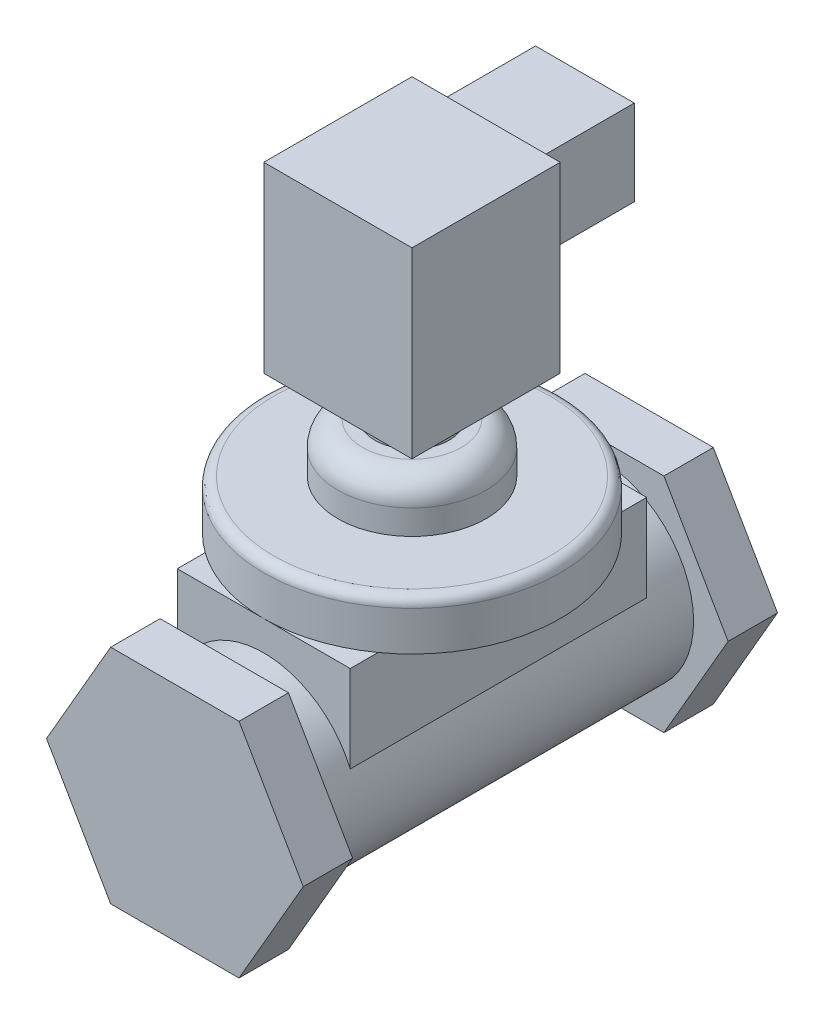
ISO-10303-21;
HEADER;
FILE_DESCRIPTION(('STEP AP214'),'2;1');
FILE_NAME('part.step','',(''),(''),'','','');
FILE_SCHEMA(('AUTOMOTIVE_DESIGN { 1 0 10303 214 1 1 1 1 }'));
ENDSEC;
DATA;
#1=APPLICATION_CONTEXT('core data for automotive mechanical design processes');
#2=APPLICATION_PROTOCOL_DEFINITION('international standard','automotive_design',2000,#1);
#3=PRODUCT_CONTEXT('',#1,'mechanical');
#4=PRODUCT('Part','Part','',(#3));
#5=PRODUCT_RELATED_PRODUCT_CATEGORY('part','',(#4));
#6=PRODUCT_DEFINITION_FORMATION('','',#4);
#7=PRODUCT_DEFINITION_CONTEXT('part definition',#1,'design');
#8=PRODUCT_DEFINITION('design','',#6,#7);
#9=PRODUCT_DEFINITION_SHAPE('','',#8);
#10=(LENGTH_UNIT() NAMED_UNIT(*) SI_UNIT(.MILLI.,.METRE.));
#11=(NAMED_UNIT(*) PLANE_ANGLE_UNIT() SI_UNIT($,.RADIAN.));
#12=(NAMED_UNIT(*) SI_UNIT($,.STERADIAN.) SOLID_ANGLE_UNIT());
#13=UNCERTAINTY_MEASURE_WITH_UNIT(LENGTH_MEASURE(1.E-05),#10,'distance_accuracy_value','');
#14=(GEOMETRIC_REPRESENTATION_CONTEXT(3) GLOBAL_UNCERTAINTY_ASSIGNED_CONTEXT((#13)) GLOBAL_UNIT_ASSIGNED_CONTEXT((#10,
#11,#12)) REPRESENTATION_CONTEXT('',''));
#15=CARTESIAN_POINT('',(0.,0.,0.));
#16=DIRECTION('',(0.,0.,1.));
#17=DIRECTION('',(1.,0.,0.));
#18=AXIS2_PLACEMENT_3D('',#15,#16,#17);
#19=CARTESIAN_POINT('',(15.,90.,-53.));
#20=DIRECTION('',(0.,0.,1.));
#21=DIRECTION('',(1.,0.,0.));
#22=AXIS2_PLACEMENT_3D('',#19,#20,#21);
#23=PLANE('',#22);
#24=DIRECTION('',(-1.,0.,0.));
#25=VECTOR('',#24,1.);
#26=CARTESIAN_POINT('',(15.,53.,-53.));
#27=LINE('',#26,#25);
#28=CARTESIAN_POINT('',(15.,53.,-53.));
#29=VERTEX_POINT('',#28);
#30=CARTESIAN_POINT('',(-15.,53.,-53.));
#31=VERTEX_POINT('',#30);
#32=EDGE_CURVE('E239',#29,#31,#27,.T.);
#33=ORIENTED_EDGE('',*,*,#32,.T.);
#34=DIRECTION('',(0.,-1.,0.));
#35=VECTOR('',#34,1.);
#36=CARTESIAN_POINT('',(-15.,90.,-53.));
#37=LINE('',#36,#35);
#38=CARTESIAN_POINT('',(-15.,90.,-53.));
#39=VERTEX_POINT('',#38);
#40=EDGE_CURVE('E265',#39,#31,#37,.T.);
#41=ORIENTED_EDGE('',*,*,#40,.F.);
#42=DIRECTION('',(-1.,0.,0.));
#43=VECTOR('',#42,1.);
#44=CARTESIAN_POINT('',(15.,90.,-53.));
#45=LINE('',#44,#43);
#46=CARTESIAN_POINT('',(15.,90.,-53.));
#47=VERTEX_POINT('',#46);
#48=EDGE_CURVE('E248',#47,#39,#45,.T.);
#49=ORIENTED_EDGE('',*,*,#48,.F.);
#50=DIRECTION('',(0.,-1.,0.));
#51=VECTOR('',#50,1.);
#52=CARTESIAN_POINT('',(15.,90.,-53.));
#53=LINE('',#52,#51);
#54=EDGE_CURVE('E268',#47,#29,#53,.T.);
#55=ORIENTED_EDGE('',*,*,#54,.T.);
#56=EDGE_LOOP('',(#33,#41,#49,#55));
#57=FACE_BOUND('',#56,.T.);
#58=DIRECTION('',(0.,-1.,0.));
#59=VECTOR('',#58,1.);
#60=CARTESIAN_POINT('',(9.99999999999999,87.8782272721139,-53.));
#61=LINE('',#60,#59);
#62=CARTESIAN_POINT('',(9.99999999999999,87.8782272721139,-53.));
#63=VERTEX_POINT('',#62);
#64=CARTESIAN_POINT('',(9.99999999999999,70.5698444613745,-53.));
#65=VERTEX_POINT('',#64);
#66=EDGE_CURVE('E235',#63,#65,#61,.T.);
#67=ORIENTED_EDGE('',*,*,#66,.F.);
#68=DIRECTION('',(1.,0.,0.));
#69=VECTOR('',#68,1.);
#70=CARTESIAN_POINT('',(9.99999999999999,87.8782272721139,-53.));
#71=LINE('',#70,#69);
#72=CARTESIAN_POINT('',(-10.,87.8782272721139,-53.));
#73=VERTEX_POINT('',#72);
#74=EDGE_CURVE('E232',#73,#63,#71,.T.);
#75=ORIENTED_EDGE('',*,*,#74,.F.);
#76=DIRECTION('',(0.,1.,0.));
#77=VECTOR('',#76,1.);
#78=CARTESIAN_POINT('',(-10.,87.8782272721139,-53.));
#79=LINE('',#78,#77);
#80=CARTESIAN_POINT('',(-10.,70.5698444613745,-53.));
#81=VERTEX_POINT('',#80);
#82=EDGE_CURVE('E56',#81,#73,#79,.T.);
#83=ORIENTED_EDGE('',*,*,#82,.F.);
#84=DIRECTION('',(-1.,0.,0.));
#85=VECTOR('',#84,1.);
#86=CARTESIAN_POINT('',(9.99999999999999,70.5698444613745,-53.));
#87=LINE('',#86,#85);
#88=EDGE_CURVE('E51',#65,#81,#87,.T.);
#89=ORIENTED_EDGE('',*,*,#88,.F.);
#90=EDGE_LOOP('',(#67,#75,#83,#89));
#91=FACE_BOUND('',#90,.T.);
#92=ADVANCED_FACE('F36',(#57,#91),#23,.F.);
#93=CARTESIAN_POINT('',(0.,45.,-38.));
#94=DIRECTION('',(0.,1.,0.));
#95=DIRECTION('',(0.,0.,1.));
#96=AXIS2_PLACEMENT_3D('',#93,#94,#95);
#97=PLANE('',#96);
#98=CARTESIAN_POINT('',(0.,45.,-38.));
#99=DIRECTION('',(0.,1.,0.));
#100=DIRECTION('',(0.,0.,1.));
#101=AXIS2_PLACEMENT_3D('',#98,#99,#100);
#102=CIRCLE('',#101,10.);
#103=CARTESIAN_POINT('',(0.,45.,-28.));
#104=VERTEX_POINT('',#103);
#105=EDGE_CURVE('E421',#104,#104,#102,.T.);
#106=ORIENTED_EDGE('',*,*,#105,.T.);
#107=EDGE_LOOP('',(#106));
#108=FACE_BOUND('',#107,.T.);
#109=CARTESIAN_POINT('',(0.,45.,-38.));
#110=DIRECTION('',(0.,1.,0.));
#111=DIRECTION('',(0.,0.,1.));
#112=AXIS2_PLACEMENT_3D('',#109,#110,#111);
#113=CIRCLE('',#112,7.5);
#114=CARTESIAN_POINT('',(0.,45.,-30.5));
#115=VERTEX_POINT('',#114);
#116=EDGE_CURVE('E271',#115,#115,#113,.T.);
#117=ORIENTED_EDGE('',*,*,#116,.F.);
#118=EDGE_LOOP('',(#117));
#119=FACE_BOUND('',#118,.T.);
#120=ADVANCED_FACE('F446',(#108,#119),#97,.T.);
#121=CARTESIAN_POINT('',(0.,35.,-38.));
#122=DIRECTION('',(0.,1.,0.));
#123=DIRECTION('',(0.,0.,1.));
#124=AXIS2_PLACEMENT_3D('',#121,#122,#123);
#125=PLANE('',#124);
#126=CARTESIAN_POINT('',(0.,35.,-38.));
#127=DIRECTION('',(0.,1.,0.));
#128=DIRECTION('',(0.,0.,1.));
#129=AXIS2_PLACEMENT_3D('',#126,#127,#128);
#130=CIRCLE('',#129,28.);
#131=CARTESIAN_POINT('',(0.,35.,-10.));
#132=VERTEX_POINT('',#131);
#133=EDGE_CURVE('E44',#132,#132,#130,.T.);
#134=ORIENTED_EDGE('',*,*,#133,.T.);
#135=EDGE_LOOP('',(#134));
#136=FACE_BOUND('',#135,.T.);
#137=CARTESIAN_POINT('',(0.,35.,-38.));
#138=DIRECTION('',(0.,1.,0.));
#139=DIRECTION('',(0.,0.,1.));
#140=AXIS2_PLACEMENT_3D('',#137,#138,#139);
#141=CIRCLE('',#140,15.);
#142=CARTESIAN_POINT('',(0.,35.,-23.));
#143=VERTEX_POINT('',#142);
#144=EDGE_CURVE('E275',#143,#143,#141,.T.);
#145=ORIENTED_EDGE('',*,*,#144,.F.);
#146=EDGE_LOOP('',(#145));
#147=FACE_BOUND('',#146,.T.);
#148=ADVANCED_FACE('F430',(#136,#147),#125,.T.);
#149=CARTESIAN_POINT('',(-17.5,25.,-68.));
#150=DIRECTION('',(0.,-1.,0.));
#151=DIRECTION('',(0.,0.,-1.));
#152=AXIS2_PLACEMENT_3D('',#149,#150,#151);
#153=PLANE('',#152);
#154=CARTESIAN_POINT('',(0.,25.,-38.));
#155=DIRECTION('',(0.,1.,0.));
#156=DIRECTION('',(0.,0.,1.));
#157=AXIS2_PLACEMENT_3D('',#154,#155,#156);
#158=CIRCLE('',#157,30.);
#159=CARTESIAN_POINT('',(17.5,25.,-62.3669858620224));
#160=VERTEX_POINT('',#159);
#161=CARTESIAN_POINT('',(0.,25.,-68.));
#162=VERTEX_POINT('',#161);
#163=EDGE_CURVE('E425',#160,#162,#158,.T.);
#164=ORIENTED_EDGE('',*,*,#163,.F.);
#165=DIRECTION('',(0.,0.,-1.));
#166=VECTOR('',#165,1.);
#167=CARTESIAN_POINT('',(17.5,25.,-8.));
#168=LINE('',#167,#166);
#169=CARTESIAN_POINT('',(17.5,25.,-68.));
#170=VERTEX_POINT('',#169);
#171=EDGE_CURVE('E294',#160,#170,#168,.T.);
#172=ORIENTED_EDGE('',*,*,#171,.T.);
#173=DIRECTION('',(-1.,0.,0.));
#174=VECTOR('',#173,1.);
#175=CARTESIAN_POINT('',(-17.5,25.,-68.));
#176=LINE('',#175,#174);
#177=EDGE_CURVE('E300',#170,#162,#176,.T.);
#178=ORIENTED_EDGE('',*,*,#177,.T.);
#179=EDGE_LOOP('',(#164,#172,#178));
#180=FACE_BOUND('',#179,.T.);
#181=ADVANCED_FACE('F475',(#180),#153,.F.);
#182=CARTESIAN_POINT('',(-17.5,25.,-62.3669858620224));
#183=VERTEX_POINT('',#182);
#184=EDGE_CURVE('E868',#162,#183,#158,.T.);
#185=ORIENTED_EDGE('',*,*,#184,.F.);
#186=CARTESIAN_POINT('',(-17.5,25.,-68.));
#187=VERTEX_POINT('',#186);
#188=EDGE_CURVE('E298',#162,#187,#176,.T.);
#189=ORIENTED_EDGE('',*,*,#188,.T.);
#190=DIRECTION('',(0.,0.,1.));
#191=VECTOR('',#190,1.);
#192=CARTESIAN_POINT('',(-17.5,25.,-8.));
#193=LINE('',#192,#191);
#194=EDGE_CURVE('E287',#187,#183,#193,.T.);
#195=ORIENTED_EDGE('',*,*,#194,.T.);
#196=EDGE_LOOP('',(#185,#189,#195));
#197=FACE_BOUND('',#196,.T.);
#198=ADVANCED_FACE('F487',(#197),#153,.F.);
#199=CARTESIAN_POINT('',(0.,25.,-8.));
#200=VERTEX_POINT('',#199);
#201=CARTESIAN_POINT('',(17.5,25.,-13.6330141379776));
#202=VERTEX_POINT('',#201);
#203=EDGE_CURVE('E281',#200,#202,#158,.T.);
#204=ORIENTED_EDGE('',*,*,#203,.F.);
#205=DIRECTION('',(1.,0.,0.));
#206=VECTOR('',#205,1.);
#207=CARTESIAN_POINT('',(-17.5,25.,-8.));
#208=LINE('',#207,#206);
#209=CARTESIAN_POINT('',(17.5,25.,-8.));
#210=VERTEX_POINT('',#209);
#211=EDGE_CURVE('E290',#200,#210,#208,.T.);
#212=ORIENTED_EDGE('',*,*,#211,.T.);
#213=EDGE_CURVE('E295',#210,#202,#168,.T.);
#214=ORIENTED_EDGE('',*,*,#213,.T.);
#215=EDGE_LOOP('',(#204,#212,#214));
#216=FACE_BOUND('',#215,.T.);
#217=ADVANCED_FACE('F795',(#216),#153,.F.);
#218=CARTESIAN_POINT('',(-17.5,25.,-13.6330141379776));
#219=VERTEX_POINT('',#218);
#220=EDGE_CURVE('E286',#219,#200,#158,.T.);
#221=ORIENTED_EDGE('',*,*,#220,.F.);
#222=CARTESIAN_POINT('',(-17.5,25.,-8.));
#223=VERTEX_POINT('',#222);
#224=EDGE_CURVE('E284',#219,#223,#193,.T.);
#225=ORIENTED_EDGE('',*,*,#224,.T.);
#226=EDGE_CURVE('E292',#223,#200,#208,.T.);
#227=ORIENTED_EDGE('',*,*,#226,.T.);
#228=EDGE_LOOP('',(#221,#225,#227));
#229=FACE_BOUND('',#228,.T.);
#230=ADVANCED_FACE('F489',(#229),#153,.F.);
#231=CARTESIAN_POINT('',(0.,0.,-76.));
#232=DIRECTION('',(0.,0.,1.));
#233=DIRECTION('',(1.,0.,0.));
#234=AXIS2_PLACEMENT_3D('',#231,#232,#233);
#235=CYLINDRICAL_SURFACE('',#234,19.);
#236=CARTESIAN_POINT('',(0.,0.,0.));
#237=DIRECTION('',(0.,0.,1.));
#238=DIRECTION('',(1.,0.,0.));
#239=AXIS2_PLACEMENT_3D('',#236,#237,#238);
#240=CIRCLE('',#239,19.);
#241=CARTESIAN_POINT('',(19.,0.,0.));
#242=VERTEX_POINT('',#241);
#243=EDGE_CURVE('E406',#242,#242,#240,.F.);
#244=ORIENTED_EDGE('',*,*,#243,.T.);
#245=EDGE_LOOP('',(#244));
#246=FACE_BOUND('',#245,.T.);
#247=CARTESIAN_POINT('',(0.,0.,-76.));
#248=DIRECTION('',(0.,0.,-1.));
#249=DIRECTION('',(-1.,0.,0.));
#250=AXIS2_PLACEMENT_3D('',#247,#248,#249);
#251=CIRCLE('',#250,19.);
#252=CARTESIAN_POINT('',(-19.,0.,-76.));
#253=VERTEX_POINT('',#252);
#254=EDGE_CURVE('E359',#253,#253,#251,.T.);
#255=ORIENTED_EDGE('',*,*,#254,.F.);
#256=EDGE_LOOP('',(#255));
#257=FACE_BOUND('',#256,.T.);
#258=DIRECTION('',(0.,0.,1.));
#259=VECTOR('',#258,1.);
#260=CARTESIAN_POINT('',(-17.5,7.39932429347438,-76.));
#261=LINE('',#260,#259);
#262=CARTESIAN_POINT('',(-17.5,7.39932429347437,-68.));
#263=VERTEX_POINT('',#262);
#264=CARTESIAN_POINT('',(-17.5,7.39932429347437,-7.99999999999999));
#265=VERTEX_POINT('',#264);
#266=EDGE_CURVE('E418',#263,#265,#261,.T.);
#267=ORIENTED_EDGE('',*,*,#266,.F.);
#268=CARTESIAN_POINT('',(0.,0.,-68.));
#269=DIRECTION('',(0.,0.,1.));
#270=DIRECTION('',(1.,0.,0.));
#271=AXIS2_PLACEMENT_3D('',#268,#269,#270);
#272=CIRCLE('',#271,19.);
#273=CARTESIAN_POINT('',(17.5,7.39932429347437,-68.));
#274=VERTEX_POINT('',#273);
#275=EDGE_CURVE('E409',#274,#263,#272,.T.);
#276=ORIENTED_EDGE('',*,*,#275,.F.);
#277=DIRECTION('',(0.,0.,1.));
#278=VECTOR('',#277,1.);
#279=CARTESIAN_POINT('',(17.5,7.39932429347438,-76.));
#280=LINE('',#279,#278);
#281=CARTESIAN_POINT('',(17.5,7.39932429347438,-7.99999999999999));
#282=VERTEX_POINT('',#281);
#283=EDGE_CURVE('E412',#282,#274,#280,.F.);
#284=ORIENTED_EDGE('',*,*,#283,.F.);
#285=CARTESIAN_POINT('',(0.,0.,-7.99999999999999));
#286=DIRECTION('',(0.,0.,-1.));
#287=DIRECTION('',(-1.,0.,0.));
#288=AXIS2_PLACEMENT_3D('',#285,#286,#287);
#289=CIRCLE('',#288,19.);
#290=EDGE_CURVE('E415',#265,#282,#289,.T.);
#291=ORIENTED_EDGE('',*,*,#290,.F.);
#292=EDGE_LOOP('',(#267,#276,#284,#291));
#293=FACE_BOUND('',#292,.T.);
#294=ADVANCED_FACE('F538',(#246,#257,#293),#235,.T.);
#295=CARTESIAN_POINT('',(-25.9807621135332,0.,0.));
#296=DIRECTION('',(0.,0.,1.));
#297=DIRECTION('',(1.,0.,0.));
#298=AXIS2_PLACEMENT_3D('',#295,#296,#297);
#299=PLANE('',#298);
#300=DIRECTION('',(-0.5,-0.866025403784439,0.));
#301=VECTOR('',#300,1.);
#302=CARTESIAN_POINT('',(-12.9903810567666,22.5,0.));
#303=LINE('',#302,#301);
#304=CARTESIAN_POINT('',(-12.9903810567666,22.5,0.));
#305=VERTEX_POINT('',#304);
#306=CARTESIAN_POINT('',(-25.9807621135332,0.,0.));
#307=VERTEX_POINT('',#306);
#308=EDGE_CURVE('E362',#305,#307,#303,.T.);
#309=ORIENTED_EDGE('',*,*,#308,.F.);
#310=DIRECTION('',(-1.,0.,0.));
#311=VECTOR('',#310,1.);
#312=CARTESIAN_POINT('',(12.9903810567666,22.5,0.));
#313=LINE('',#312,#311);
#314=CARTESIAN_POINT('',(12.9903810567666,22.5,0.));
#315=VERTEX_POINT('',#314);
#316=EDGE_CURVE('E367',#315,#305,#313,.T.);
#317=ORIENTED_EDGE('',*,*,#316,.F.);
#318=DIRECTION('',(-0.5,0.866025403784439,0.));
#319=VECTOR('',#318,1.);
#320=CARTESIAN_POINT('',(25.9807621135332,0.,0.));
#321=LINE('',#320,#319);
#322=CARTESIAN_POINT('',(25.9807621135332,0.,0.));
#323=VERTEX_POINT('',#322);
#324=EDGE_CURVE('E386',#323,#315,#321,.T.);
#325=ORIENTED_EDGE('',*,*,#324,.F.);
#326=DIRECTION('',(0.5,0.866025403784439,0.));
#327=VECTOR('',#326,1.);
#328=CARTESIAN_POINT('',(12.9903810567666,-22.5,0.));
#329=LINE('',#328,#327);
#330=CARTESIAN_POINT('',(12.9903810567666,-22.5,0.));
#331=VERTEX_POINT('',#330);
#332=EDGE_CURVE('E384',#331,#323,#329,.T.);
#333=ORIENTED_EDGE('',*,*,#332,.F.);
#334=DIRECTION('',(1.,0.,0.));
#335=VECTOR('',#334,1.);
#336=CARTESIAN_POINT('',(-12.9903810567666,-22.5,0.));
#337=LINE('',#336,#335);
#338=CARTESIAN_POINT('',(-12.9903810567666,-22.5,0.));
#339=VERTEX_POINT('',#338);
#340=EDGE_CURVE('E382',#339,#331,#337,.T.);
#341=ORIENTED_EDGE('',*,*,#340,.F.);
#342=DIRECTION('',(0.5,-0.866025403784439,0.));
#343=VECTOR('',#342,1.);
#344=CARTESIAN_POINT('',(-25.9807621135332,0.,0.));
#345=LINE('',#344,#343);
#346=EDGE_CURVE('E380',#307,#339,#345,.T.);
#347=ORIENTED_EDGE('',*,*,#346,.F.);
#348=EDGE_LOOP('',(#309,#317,#325,#333,#341,#347));
#349=FACE_BOUND('',#348,.T.);
#350=ORIENTED_EDGE('',*,*,#243,.F.);
#351=EDGE_LOOP('',(#350));
#352=FACE_BOUND('',#351,.T.);
#353=ADVANCED_FACE('F541',(#349,#352),#299,.F.);
#354=CARTESIAN_POINT('',(-12.9903810567666,22.5,10.));
#355=DIRECTION('',(0.866025403784439,-0.5,0.));
#356=DIRECTION('',(0.5,0.866025403784439,0.));
#357=AXIS2_PLACEMENT_3D('',#354,#355,#356);
#358=PLANE('',#357);
#359=ORIENTED_EDGE('',*,*,#308,.T.);
#360=DIRECTION('',(0.,0.,-1.));
#361=VECTOR('',#360,1.);
#362=CARTESIAN_POINT('',(-25.9807621135332,0.,10.));
#363=LINE('',#362,#361);
#364=CARTESIAN_POINT('',(-25.9807621135332,0.,10.));
#365=VERTEX_POINT('',#364);
#366=EDGE_CURVE('E403',#365,#307,#363,.T.);
#367=ORIENTED_EDGE('',*,*,#366,.F.);
#368=DIRECTION('',(-0.5,-0.866025403784439,0.));
#369=VECTOR('',#368,1.);
#370=CARTESIAN_POINT('',(-12.9903810567666,22.5,10.));
#371=LINE('',#370,#369);
#372=CARTESIAN_POINT('',(-12.9903810567666,22.5,10.));
#373=VERTEX_POINT('',#372);
#374=EDGE_CURVE('E363',#373,#365,#371,.T.);
#375=ORIENTED_EDGE('',*,*,#374,.F.);
#376=DIRECTION('',(0.,0.,-1.));
#377=VECTOR('',#376,1.);
#378=CARTESIAN_POINT('',(-12.9903810567666,22.5,10.));
#379=LINE('',#378,#377);
#380=EDGE_CURVE('E377',#373,#305,#379,.T.);
#381=ORIENTED_EDGE('',*,*,#380,.T.);
#382=EDGE_LOOP('',(#359,#367,#375,#381));
#383=FACE_BOUND('',#382,.T.);
#384=ADVANCED_FACE('F549',(#383),#358,.F.);
#385=CARTESIAN_POINT('',(-25.9807621135332,0.,10.));
#386=DIRECTION('',(0.866025403784439,0.5,0.));
#387=DIRECTION('',(-0.5,0.866025403784439,0.));
#388=AXIS2_PLACEMENT_3D('',#385,#386,#387);
#389=PLANE('',#388);
#390=ORIENTED_EDGE('',*,*,#346,.T.);
#391=DIRECTION('',(0.,0.,-1.));
#392=VECTOR('',#391,1.);
#393=CARTESIAN_POINT('',(-12.9903810567666,-22.5,10.));
#394=LINE('',#393,#392);
#395=CARTESIAN_POINT('',(-12.9903810567666,-22.5,10.));
#396=VERTEX_POINT('',#395);
#397=EDGE_CURVE('E400',#396,#339,#394,.T.);
#398=ORIENTED_EDGE('',*,*,#397,.F.);
#399=DIRECTION('',(0.5,-0.866025403784439,0.));
#400=VECTOR('',#399,1.);
#401=CARTESIAN_POINT('',(-25.9807621135332,0.,10.));
#402=LINE('',#401,#400);
#403=EDGE_CURVE('E366',#365,#396,#402,.T.);
#404=ORIENTED_EDGE('',*,*,#403,.F.);
#405=ORIENTED_EDGE('',*,*,#366,.T.);
#406=EDGE_LOOP('',(#390,#398,#404,#405));
#407=FACE_BOUND('',#406,.T.);
#408=ADVANCED_FACE('F565',(#407),#389,.F.);
#409=CARTESIAN_POINT('',(-12.9903810567666,-22.5,10.));
#410=DIRECTION('',(0.,1.,0.));
#411=DIRECTION('',(-1.,0.,0.));
#412=AXIS2_PLACEMENT_3D('',#409,#410,#411);
#413=PLANE('',#412);
#414=ORIENTED_EDGE('',*,*,#340,.T.);
#415=DIRECTION('',(0.,0.,-1.));
#416=VECTOR('',#415,1.);
#417=CARTESIAN_POINT('',(12.9903810567666,-22.5,10.));
#418=LINE('',#417,#416);
#419=CARTESIAN_POINT('',(12.9903810567666,-22.5,10.));
#420=VERTEX_POINT('',#419);
#421=EDGE_CURVE('E397',#420,#331,#418,.T.);
#422=ORIENTED_EDGE('',*,*,#421,.F.);
#423=DIRECTION('',(1.,0.,0.));
#424=VECTOR('',#423,1.);
#425=CARTESIAN_POINT('',(-12.9903810567666,-22.5,10.));
#426=LINE('',#425,#424);
#427=EDGE_CURVE('E369',#396,#420,#426,.T.);
#428=ORIENTED_EDGE('',*,*,#427,.F.);
#429=ORIENTED_EDGE('',*,*,#397,.T.);
#430=EDGE_LOOP('',(#414,#422,#428,#429));
#431=FACE_BOUND('',#430,.T.);
#432=ADVANCED_FACE('F561',(#431),#413,.F.);
#433=CARTESIAN_POINT('',(12.9903810567666,-22.5,10.));
#434=DIRECTION('',(-0.866025403784439,0.5,0.));
#435=DIRECTION('',(-0.5,-0.866025403784439,0.));
#436=AXIS2_PLACEMENT_3D('',#433,#434,#435);
#437=PLANE('',#436);
#438=ORIENTED_EDGE('',*,*,#332,.T.);
#439=DIRECTION('',(0.,0.,-1.));
#440=VECTOR('',#439,1.);
#441=CARTESIAN_POINT('',(25.9807621135332,0.,10.));
#442=LINE('',#441,#440);
#443=CARTESIAN_POINT('',(25.9807621135332,0.,10.));
#444=VERTEX_POINT('',#443);
#445=EDGE_CURVE('E394',#444,#323,#442,.T.);
#446=ORIENTED_EDGE('',*,*,#445,.F.);
#447=DIRECTION('',(0.5,0.866025403784439,0.));
#448=VECTOR('',#447,1.);
#449=CARTESIAN_POINT('',(12.9903810567666,-22.5,10.));
#450=LINE('',#449,#448);
#451=EDGE_CURVE('E371',#420,#444,#450,.T.);
#452=ORIENTED_EDGE('',*,*,#451,.F.);
#453=ORIENTED_EDGE('',*,*,#421,.T.);
#454=EDGE_LOOP('',(#438,#446,#452,#453));
#455=FACE_BOUND('',#454,.T.);
#456=ADVANCED_FACE('F557',(#455),#437,.F.);
#457=CARTESIAN_POINT('',(25.9807621135332,0.,10.));
#458=DIRECTION('',(-0.866025403784439,-0.5,0.));
#459=DIRECTION('',(0.5,-0.866025403784439,0.));
#460=AXIS2_PLACEMENT_3D('',#457,#458,#459);
#461=PLANE('',#460);
#462=ORIENTED_EDGE('',*,*,#324,.T.);
#463=DIRECTION('',(0.,0.,-1.));
#464=VECTOR('',#463,1.);
#465=CARTESIAN_POINT('',(12.9903810567666,22.5,10.));
#466=LINE('',#465,#464);
#467=CARTESIAN_POINT('',(12.9903810567666,22.5,10.));
#468=VERTEX_POINT('',#467);
#469=EDGE_CURVE('E391',#468,#315,#466,.T.);
#470=ORIENTED_EDGE('',*,*,#469,.F.);
#471=DIRECTION('',(-0.5,0.866025403784439,0.));
#472=VECTOR('',#471,1.);
#473=CARTESIAN_POINT('',(25.9807621135332,0.,10.));
#474=LINE('',#473,#472);
#475=EDGE_CURVE('E373',#444,#468,#474,.T.);
#476=ORIENTED_EDGE('',*,*,#475,.F.);
#477=ORIENTED_EDGE('',*,*,#445,.T.);
#478=EDGE_LOOP('',(#462,#470,#476,#477));
#479=FACE_BOUND('',#478,.T.);
#480=ADVANCED_FACE('F553',(#479),#461,.F.);
#481=CARTESIAN_POINT('',(12.9903810567666,22.5,10.));
#482=DIRECTION('',(0.,-1.,0.));
#483=DIRECTION('',(1.,0.,0.));
#484=AXIS2_PLACEMENT_3D('',#481,#482,#483);
#485=PLANE('',#484);
#486=ORIENTED_EDGE('',*,*,#316,.T.);
#487=ORIENTED_EDGE('',*,*,#380,.F.);
#488=DIRECTION('',(-1.,0.,0.));
#489=VECTOR('',#488,1.);
#490=CARTESIAN_POINT('',(12.9903810567666,22.5,10.));
#491=LINE('',#490,#489);
#492=EDGE_CURVE('E375',#468,#373,#491,.T.);
#493=ORIENTED_EDGE('',*,*,#492,.F.);
#494=ORIENTED_EDGE('',*,*,#469,.T.);
#495=EDGE_LOOP('',(#486,#487,#493,#494));
#496=FACE_BOUND('',#495,.T.);
#497=ADVANCED_FACE('F545',(#496),#485,.F.);
#498=CARTESIAN_POINT('',(-25.9807621135332,0.,10.));
#499=DIRECTION('',(0.,0.,1.));
#500=DIRECTION('',(1.,0.,0.));
#501=AXIS2_PLACEMENT_3D('',#498,#499,#500);
#502=PLANE('',#501);
#503=ORIENTED_EDGE('',*,*,#374,.T.);
#504=ORIENTED_EDGE('',*,*,#403,.T.);
#505=ORIENTED_EDGE('',*,*,#427,.T.);
#506=ORIENTED_EDGE('',*,*,#451,.T.);
#507=ORIENTED_EDGE('',*,*,#475,.T.);
#508=ORIENTED_EDGE('',*,*,#492,.T.);
#509=EDGE_LOOP('',(#503,#504,#505,#506,#507,#508));
#510=FACE_BOUND('',#509,.T.);
#511=ADVANCED_FACE('F514',(#510),#502,.T.);
#512=CARTESIAN_POINT('',(-12.9903810567666,-22.5,-76.));
#513=DIRECTION('',(0.,0.,1.));
#514=DIRECTION('',(1.,0.,0.));
#515=AXIS2_PLACEMENT_3D('',#512,#513,#514);
#516=PLANE('',#515);
#517=DIRECTION('',(-0.5,0.866025403784438,0.));
#518=VECTOR('',#517,1.);
#519=CARTESIAN_POINT('',(-12.9903810567666,-22.5,-76.));
#520=LINE('',#519,#518);
#521=CARTESIAN_POINT('',(-12.9903810567666,-22.5,-76.));
#522=VERTEX_POINT('',#521);
#523=CARTESIAN_POINT('',(-25.9807621135332,0.,-76.));
#524=VERTEX_POINT('',#523);
#525=EDGE_CURVE('E315',#522,#524,#520,.T.);
#526=ORIENTED_EDGE('',*,*,#525,.F.);
#527=DIRECTION('',(-1.,0.,0.));
#528=VECTOR('',#527,1.);
#529=CARTESIAN_POINT('',(12.9903810567666,-22.5,-76.));
#530=LINE('',#529,#528);
#531=CARTESIAN_POINT('',(12.9903810567666,-22.5,-76.));
#532=VERTEX_POINT('',#531);
#533=EDGE_CURVE('E320',#532,#522,#530,.T.);
#534=ORIENTED_EDGE('',*,*,#533,.F.);
#535=DIRECTION('',(-0.5,-0.866025403784439,0.));
#536=VECTOR('',#535,1.);
#537=CARTESIAN_POINT('',(25.9807621135332,0.,-76.));
#538=LINE('',#537,#536);
#539=CARTESIAN_POINT('',(25.9807621135332,0.,-76.));
#540=VERTEX_POINT('',#539);
#541=EDGE_CURVE('E339',#540,#532,#538,.T.);
#542=ORIENTED_EDGE('',*,*,#541,.F.);
#543=DIRECTION('',(0.5,-0.866025403784438,0.));
#544=VECTOR('',#543,1.);
#545=CARTESIAN_POINT('',(12.9903810567666,22.5,-76.));
#546=LINE('',#545,#544);
#547=CARTESIAN_POINT('',(12.9903810567666,22.5,-76.));
#548=VERTEX_POINT('',#547);
#549=EDGE_CURVE('E337',#548,#540,#546,.T.);
#550=ORIENTED_EDGE('',*,*,#549,.F.);
#551=DIRECTION('',(1.,0.,0.));
#552=VECTOR('',#551,1.);
#553=CARTESIAN_POINT('',(-12.9903810567666,22.5,-76.));
#554=LINE('',#553,#552);
#555=CARTESIAN_POINT('',(-12.9903810567666,22.5,-76.));
#556=VERTEX_POINT('',#555);
#557=EDGE_CURVE('E335',#556,#548,#554,.T.);
#558=ORIENTED_EDGE('',*,*,#557,.F.);
#559=DIRECTION('',(0.5,0.866025403784439,0.));
#560=VECTOR('',#559,1.);
#561=CARTESIAN_POINT('',(-25.9807621135332,0.,-76.));
#562=LINE('',#561,#560);
#563=EDGE_CURVE('E333',#524,#556,#562,.T.);
#564=ORIENTED_EDGE('',*,*,#563,.F.);
#565=EDGE_LOOP('',(#526,#534,#542,#550,#558,#564));
#566=FACE_BOUND('',#565,.T.);
#567=ORIENTED_EDGE('',*,*,#254,.T.);
#568=EDGE_LOOP('',(#567));
#569=FACE_BOUND('',#568,.T.);
#570=ADVANCED_FACE('F510',(#566,#569),#516,.T.);
#571=CARTESIAN_POINT('',(-12.9903810567666,-22.5,-86.));
#572=DIRECTION('',(0.866025403784439,0.5,0.));
#573=DIRECTION('',(-0.5,0.866025403784439,0.));
#574=AXIS2_PLACEMENT_3D('',#571,#572,#573);
#575=PLANE('',#574);
#576=ORIENTED_EDGE('',*,*,#525,.T.);
#577=DIRECTION('',(0.,0.,1.));
#578=VECTOR('',#577,1.);
#579=CARTESIAN_POINT('',(-25.9807621135332,0.,-86.));
#580=LINE('',#579,#578);
#581=CARTESIAN_POINT('',(-25.9807621135332,0.,-86.));
#582=VERTEX_POINT('',#581);
#583=EDGE_CURVE('E356',#582,#524,#580,.T.);
#584=ORIENTED_EDGE('',*,*,#583,.F.);
#585=DIRECTION('',(-0.5,0.866025403784438,0.));
#586=VECTOR('',#585,1.);
#587=CARTESIAN_POINT('',(-12.9903810567666,-22.5,-86.));
#588=LINE('',#587,#586);
#589=CARTESIAN_POINT('',(-12.9903810567666,-22.5,-86.));
#590=VERTEX_POINT('',#589);
#591=EDGE_CURVE('E316',#590,#582,#588,.T.);
#592=ORIENTED_EDGE('',*,*,#591,.F.);
#593=DIRECTION('',(0.,0.,1.));
#594=VECTOR('',#593,1.);
#595=CARTESIAN_POINT('',(-12.9903810567666,-22.5,-86.));
#596=LINE('',#595,#594);
#597=EDGE_CURVE('E330',#590,#522,#596,.T.);
#598=ORIENTED_EDGE('',*,*,#597,.T.);
#599=EDGE_LOOP('',(#576,#584,#592,#598));
#600=FACE_BOUND('',#599,.T.);
#601=ADVANCED_FACE('F513',(#600),#575,.F.);
#602=CARTESIAN_POINT('',(-25.9807621135332,0.,-86.));
#603=DIRECTION('',(0.866025403784439,-0.5,0.));
#604=DIRECTION('',(0.5,0.866025403784439,0.));
#605=AXIS2_PLACEMENT_3D('',#602,#603,#604);
#606=PLANE('',#605);
#607=ORIENTED_EDGE('',*,*,#563,.T.);
#608=DIRECTION('',(0.,0.,1.));
#609=VECTOR('',#608,1.);
#610=CARTESIAN_POINT('',(-12.9903810567666,22.5,-86.));
#611=LINE('',#610,#609);
#612=CARTESIAN_POINT('',(-12.9903810567666,22.5,-86.));
#613=VERTEX_POINT('',#612);
#614=EDGE_CURVE('E353',#613,#556,#611,.T.);
#615=ORIENTED_EDGE('',*,*,#614,.F.);
#616=DIRECTION('',(0.5,0.866025403784439,0.));
#617=VECTOR('',#616,1.);
#618=CARTESIAN_POINT('',(-25.9807621135332,0.,-86.));
#619=LINE('',#618,#617);
#620=EDGE_CURVE('E319',#582,#613,#619,.T.);
#621=ORIENTED_EDGE('',*,*,#620,.F.);
#622=ORIENTED_EDGE('',*,*,#583,.T.);
#623=EDGE_LOOP('',(#607,#615,#621,#622));
#624=FACE_BOUND('',#623,.T.);
#625=ADVANCED_FACE('F530',(#624),#606,.F.);
#626=CARTESIAN_POINT('',(-12.9903810567666,22.5,-86.));
#627=DIRECTION('',(0.,-1.,0.));
#628=DIRECTION('',(1.,0.,0.));
#629=AXIS2_PLACEMENT_3D('',#626,#627,#628);
#630=PLANE('',#629);
#631=ORIENTED_EDGE('',*,*,#557,.T.);
#632=DIRECTION('',(0.,0.,1.));
#633=VECTOR('',#632,1.);
#634=CARTESIAN_POINT('',(12.9903810567666,22.5,-86.));
#635=LINE('',#634,#633);
#636=CARTESIAN_POINT('',(12.9903810567666,22.5,-86.));
#637=VERTEX_POINT('',#636);
#638=EDGE_CURVE('E350',#637,#548,#635,.T.);
#639=ORIENTED_EDGE('',*,*,#638,.F.);
#640=DIRECTION('',(1.,0.,0.));
#641=VECTOR('',#640,1.);
#642=CARTESIAN_POINT('',(-12.9903810567666,22.5,-86.));
#643=LINE('',#642,#641);
#644=EDGE_CURVE('E322',#613,#637,#643,.T.);
#645=ORIENTED_EDGE('',*,*,#644,.F.);
#646=ORIENTED_EDGE('',*,*,#614,.T.);
#647=EDGE_LOOP('',(#631,#639,#645,#646));
#648=FACE_BOUND('',#647,.T.);
#649=ADVANCED_FACE('F526',(#648),#630,.F.);
#650=CARTESIAN_POINT('',(12.9903810567666,22.5,-86.));
#651=DIRECTION('',(-0.866025403784439,-0.5,0.));
#652=DIRECTION('',(0.5,-0.866025403784439,0.));
#653=AXIS2_PLACEMENT_3D('',#650,#651,#652);
#654=PLANE('',#653);
#655=ORIENTED_EDGE('',*,*,#549,.T.);
#656=DIRECTION('',(0.,0.,1.));
#657=VECTOR('',#656,1.);
#658=CARTESIAN_POINT('',(25.9807621135332,0.,-86.));
#659=LINE('',#658,#657);
#660=CARTESIAN_POINT('',(25.9807621135332,0.,-86.));
#661=VERTEX_POINT('',#660);
#662=EDGE_CURVE('E347',#661,#540,#659,.T.);
#663=ORIENTED_EDGE('',*,*,#662,.F.);
#664=DIRECTION('',(0.5,-0.866025403784438,0.));
#665=VECTOR('',#664,1.);
#666=CARTESIAN_POINT('',(12.9903810567666,22.5,-86.));
#667=LINE('',#666,#665);
#668=EDGE_CURVE('E324',#637,#661,#667,.T.);
#669=ORIENTED_EDGE('',*,*,#668,.F.);
#670=ORIENTED_EDGE('',*,*,#638,.T.);
#671=EDGE_LOOP('',(#655,#663,#669,#670));
#672=FACE_BOUND('',#671,.T.);
#673=ADVANCED_FACE('F522',(#672),#654,.F.);
#674=CARTESIAN_POINT('',(25.9807621135332,0.,-86.));
#675=DIRECTION('',(-0.866025403784439,0.5,0.));
#676=DIRECTION('',(-0.5,-0.866025403784439,0.));
#677=AXIS2_PLACEMENT_3D('',#674,#675,#676);
#678=PLANE('',#677);
#679=ORIENTED_EDGE('',*,*,#541,.T.);
#680=DIRECTION('',(0.,0.,1.));
#681=VECTOR('',#680,1.);
#682=CARTESIAN_POINT('',(12.9903810567666,-22.5,-86.));
#683=LINE('',#682,#681);
#684=CARTESIAN_POINT('',(12.9903810567666,-22.5,-86.));
#685=VERTEX_POINT('',#684);
#686=EDGE_CURVE('E344',#685,#532,#683,.T.);
#687=ORIENTED_EDGE('',*,*,#686,.F.);
#688=DIRECTION('',(-0.5,-0.866025403784439,0.));
#689=VECTOR('',#688,1.);
#690=CARTESIAN_POINT('',(25.9807621135332,0.,-86.));
#691=LINE('',#690,#689);
#692=EDGE_CURVE('E326',#661,#685,#691,.T.);
#693=ORIENTED_EDGE('',*,*,#692,.F.);
#694=ORIENTED_EDGE('',*,*,#662,.T.);
#695=EDGE_LOOP('',(#679,#687,#693,#694));
#696=FACE_BOUND('',#695,.T.);
#697=ADVANCED_FACE('F518',(#696),#678,.F.);
#698=CARTESIAN_POINT('',(12.9903810567666,-22.5,-86.));
#699=DIRECTION('',(0.,1.,0.));
#700=DIRECTION('',(-1.,0.,0.));
#701=AXIS2_PLACEMENT_3D('',#698,#699,#700);
#702=PLANE('',#701);
#703=ORIENTED_EDGE('',*,*,#533,.T.);
#704=ORIENTED_EDGE('',*,*,#597,.F.);
#705=DIRECTION('',(-1.,0.,0.));
#706=VECTOR('',#705,1.);
#707=CARTESIAN_POINT('',(12.9903810567666,-22.5,-86.));
#708=LINE('',#707,#706);
#709=EDGE_CURVE('E328',#685,#590,#708,.T.);
#710=ORIENTED_EDGE('',*,*,#709,.F.);
#711=ORIENTED_EDGE('',*,*,#686,.T.);
#712=EDGE_LOOP('',(#703,#704,#710,#711));
#713=FACE_BOUND('',#712,.T.);
#714=ADVANCED_FACE('F508',(#713),#702,.F.);
#715=CARTESIAN_POINT('',(-12.9903810567666,-22.5,-86.));
#716=DIRECTION('',(0.,0.,1.));
#717=DIRECTION('',(1.,0.,0.));
#718=AXIS2_PLACEMENT_3D('',#715,#716,#717);
#719=PLANE('',#718);
#720=ORIENTED_EDGE('',*,*,#591,.T.);
#721=ORIENTED_EDGE('',*,*,#620,.T.);
#722=ORIENTED_EDGE('',*,*,#644,.T.);
#723=ORIENTED_EDGE('',*,*,#668,.T.);
#724=ORIENTED_EDGE('',*,*,#692,.T.);
#725=ORIENTED_EDGE('',*,*,#709,.T.);
#726=EDGE_LOOP('',(#720,#721,#722,#723,#724,#725));
#727=FACE_BOUND('',#726,.T.);
#728=ADVANCED_FACE('F504',(#727),#719,.F.);
#729=CARTESIAN_POINT('',(-17.5,25.,-8.));
#730=DIRECTION('',(1.,0.,0.));
#731=DIRECTION('',(0.,0.,-1.));
#732=AXIS2_PLACEMENT_3D('',#729,#730,#731);
#733=PLANE('',#732);
#734=DIRECTION('',(0.,-1.,0.));
#735=VECTOR('',#734,1.);
#736=CARTESIAN_POINT('',(-17.5,25.,-68.));
#737=LINE('',#736,#735);
#738=EDGE_CURVE('E303',#187,#263,#737,.T.);
#739=ORIENTED_EDGE('',*,*,#738,.T.);
#740=ORIENTED_EDGE('',*,*,#266,.T.);
#741=DIRECTION('',(0.,-1.,0.));
#742=VECTOR('',#741,1.);
#743=CARTESIAN_POINT('',(-17.5,25.,-8.));
#744=LINE('',#743,#742);
#745=EDGE_CURVE('E312',#223,#265,#744,.T.);
#746=ORIENTED_EDGE('',*,*,#745,.F.);
#747=ORIENTED_EDGE('',*,*,#224,.F.);
#748=EDGE_CURVE('E291',#183,#219,#193,.T.);
#749=ORIENTED_EDGE('',*,*,#748,.F.);
#750=ORIENTED_EDGE('',*,*,#194,.F.);
#751=EDGE_LOOP('',(#739,#740,#746,#747,#749,#750));
#752=FACE_BOUND('',#751,.T.);
#753=ADVANCED_FACE('F500',(#752),#733,.F.);
#754=CARTESIAN_POINT('',(-17.5,25.,-8.));
#755=DIRECTION('',(0.,0.,-1.));
#756=DIRECTION('',(-1.,0.,0.));
#757=AXIS2_PLACEMENT_3D('',#754,#755,#756);
#758=PLANE('',#757);
#759=ORIENTED_EDGE('',*,*,#745,.T.);
#760=ORIENTED_EDGE('',*,*,#290,.T.);
#761=DIRECTION('',(0.,-1.,0.));
#762=VECTOR('',#761,1.);
#763=CARTESIAN_POINT('',(17.5,25.,-8.));
#764=LINE('',#763,#762);
#765=EDGE_CURVE('E309',#210,#282,#764,.T.);
#766=ORIENTED_EDGE('',*,*,#765,.F.);
#767=ORIENTED_EDGE('',*,*,#211,.F.);
#768=ORIENTED_EDGE('',*,*,#226,.F.);
#769=EDGE_LOOP('',(#759,#760,#766,#767,#768));
#770=FACE_BOUND('',#769,.T.);
#771=ADVANCED_FACE('F496',(#770),#758,.F.);
#772=CARTESIAN_POINT('',(17.5,25.,-8.));
#773=DIRECTION('',(-1.,0.,0.));
#774=DIRECTION('',(0.,0.,1.));
#775=AXIS2_PLACEMENT_3D('',#772,#773,#774);
#776=PLANE('',#775);
#777=ORIENTED_EDGE('',*,*,#765,.T.);
#778=ORIENTED_EDGE('',*,*,#283,.T.);
#779=DIRECTION('',(0.,-1.,0.));
#780=VECTOR('',#779,1.);
#781=CARTESIAN_POINT('',(17.5,25.,-68.));
#782=LINE('',#781,#780);
#783=EDGE_CURVE('E306',#170,#274,#782,.T.);
#784=ORIENTED_EDGE('',*,*,#783,.F.);
#785=ORIENTED_EDGE('',*,*,#171,.F.);
#786=EDGE_CURVE('E299',#202,#160,#168,.T.);
#787=ORIENTED_EDGE('',*,*,#786,.F.);
#788=ORIENTED_EDGE('',*,*,#213,.F.);
#789=EDGE_LOOP('',(#777,#778,#784,#785,#787,#788));
#790=FACE_BOUND('',#789,.T.);
#791=ADVANCED_FACE('F492',(#790),#776,.F.);
#792=CARTESIAN_POINT('',(-17.5,25.,-68.));
#793=DIRECTION('',(0.,0.,1.));
#794=DIRECTION('',(1.,0.,0.));
#795=AXIS2_PLACEMENT_3D('',#792,#793,#794);
#796=PLANE('',#795);
#797=ORIENTED_EDGE('',*,*,#783,.T.);
#798=ORIENTED_EDGE('',*,*,#275,.T.);
#799=ORIENTED_EDGE('',*,*,#738,.F.);
#800=ORIENTED_EDGE('',*,*,#188,.F.);
#801=ORIENTED_EDGE('',*,*,#177,.F.);
#802=EDGE_LOOP('',(#797,#798,#799,#800,#801));
#803=FACE_BOUND('',#802,.T.);
#804=ADVANCED_FACE('F480',(#803),#796,.F.);
#805=CARTESIAN_POINT('',(0.,25.,-38.));
#806=DIRECTION('',(0.,1.,0.));
#807=DIRECTION('',(0.,0.,1.));
#808=AXIS2_PLACEMENT_3D('',#805,#806,#807);
#809=PLANE('',#808);
#810=EDGE_CURVE('E280',#183,#219,#158,.T.);
#811=ORIENTED_EDGE('',*,*,#810,.F.);
#812=ORIENTED_EDGE('',*,*,#748,.T.);
#813=EDGE_LOOP('',(#811,#812));
#814=FACE_BOUND('',#813,.T.);
#815=ADVANCED_FACE('F476',(#814),#809,.F.);
#816=EDGE_CURVE('E285',#202,#160,#158,.T.);
#817=ORIENTED_EDGE('',*,*,#816,.F.);
#818=ORIENTED_EDGE('',*,*,#786,.T.);
#819=EDGE_LOOP('',(#817,#818));
#820=FACE_BOUND('',#819,.T.);
#821=ADVANCED_FACE('F479',(#820),#809,.F.);
#822=CARTESIAN_POINT('',(0.,35.,-38.));
#823=DIRECTION('',(0.,-1.,0.));
#824=DIRECTION('',(0.,0.,-1.));
#825=AXIS2_PLACEMENT_3D('',#822,#823,#824);
#826=CYLINDRICAL_SURFACE('',#825,30.);
#827=CARTESIAN_POINT('',(0.,33.,-38.));
#828=DIRECTION('',(0.,1.,0.));
#829=DIRECTION('',(0.,0.,1.));
#830=AXIS2_PLACEMENT_3D('',#827,#828,#829);
#831=CIRCLE('',#830,30.);
#832=CARTESIAN_POINT('',(0.,33.,-8.));
#833=VERTEX_POINT('',#832);
#834=EDGE_CURVE('E11',#833,#833,#831,.F.);
#835=ORIENTED_EDGE('',*,*,#834,.T.);
#836=EDGE_LOOP('',(#835));
#837=FACE_BOUND('',#836,.T.);
#838=ORIENTED_EDGE('',*,*,#203,.T.);
#839=ORIENTED_EDGE('',*,*,#816,.T.);
#840=ORIENTED_EDGE('',*,*,#163,.T.);
#841=ORIENTED_EDGE('',*,*,#184,.T.);
#842=ORIENTED_EDGE('',*,*,#810,.T.);
#843=ORIENTED_EDGE('',*,*,#220,.T.);
#844=EDGE_LOOP('',(#838,#839,#840,#841,#842,#843));
#845=FACE_BOUND('',#844,.T.);
#846=ADVANCED_FACE('F471',(#837,#845),#826,.T.);
#847=CARTESIAN_POINT('',(0.,45.,-38.));
#848=DIRECTION('',(0.,-1.,0.));
#849=DIRECTION('',(0.,0.,-1.));
#850=AXIS2_PLACEMENT_3D('',#847,#848,#849);
#851=CYLINDRICAL_SURFACE('',#850,15.);
#852=CARTESIAN_POINT('',(0.,40.,-38.));
#853=DIRECTION('',(0.,1.,0.));
#854=DIRECTION('',(0.,0.,1.));
#855=AXIS2_PLACEMENT_3D('',#852,#853,#854);
#856=CIRCLE('',#855,15.);
#857=CARTESIAN_POINT('',(0.,40.,-23.));
#858=VERTEX_POINT('',#857);
#859=EDGE_CURVE('E424',#858,#858,#856,.F.);
#860=ORIENTED_EDGE('',*,*,#859,.T.);
#861=EDGE_LOOP('',(#860));
#862=FACE_BOUND('',#861,.T.);
#863=ORIENTED_EDGE('',*,*,#144,.T.);
#864=EDGE_LOOP('',(#863));
#865=FACE_BOUND('',#864,.T.);
#866=ADVANCED_FACE('F468',(#862,#865),#851,.T.);
#867=CARTESIAN_POINT('',(0.,40.,-38.));
#868=DIRECTION('',(0.,1.,0.));
#869=DIRECTION('',(0.,0.,1.));
#870=AXIS2_PLACEMENT_3D('',#867,#868,#869);
#871=TOROIDAL_SURFACE('',#870,10.,5.);
#872=ORIENTED_EDGE('',*,*,#859,.F.);
#873=EDGE_LOOP('',(#872));
#874=FACE_BOUND('',#873,.T.);
#875=ORIENTED_EDGE('',*,*,#105,.F.);
#876=EDGE_LOOP('',(#875));
#877=FACE_BOUND('',#876,.T.);
#878=ADVANCED_FACE('F465',(#874,#877),#871,.T.);
#879=CARTESIAN_POINT('',(0.,53.,-38.));
#880=DIRECTION('',(0.,-1.,0.));
#881=DIRECTION('',(0.,0.,-1.));
#882=AXIS2_PLACEMENT_3D('',#879,#880,#881);
#883=CYLINDRICAL_SURFACE('',#882,7.5);
#884=CARTESIAN_POINT('',(0.,53.,-38.));
#885=DIRECTION('',(0.,1.,0.));
#886=DIRECTION('',(0.,0.,1.));
#887=AXIS2_PLACEMENT_3D('',#884,#885,#886);
#888=CIRCLE('',#887,7.5);
#889=CARTESIAN_POINT('',(0.,53.,-30.5));
#890=VERTEX_POINT('',#889);
#891=EDGE_CURVE('E272',#890,#890,#888,.T.);
#892=ORIENTED_EDGE('',*,*,#891,.F.);
#893=EDGE_LOOP('',(#892));
#894=FACE_BOUND('',#893,.T.);
#895=ORIENTED_EDGE('',*,*,#116,.T.);
#896=EDGE_LOOP('',(#895));
#897=FACE_BOUND('',#896,.T.);
#898=ADVANCED_FACE('F463',(#894,#897),#883,.T.);
#899=CARTESIAN_POINT('',(15.,53.,-23.));
#900=DIRECTION('',(0.,-1.,0.));
#901=DIRECTION('',(0.,0.,-1.));
#902=AXIS2_PLACEMENT_3D('',#899,#900,#901);
#903=PLANE('',#902);
#904=DIRECTION('',(0.,0.,-1.));
#905=VECTOR('',#904,1.);
#906=CARTESIAN_POINT('',(15.,53.,-53.));
#907=LINE('',#906,#905);
#908=CARTESIAN_POINT('',(15.,53.,-23.));
#909=VERTEX_POINT('',#908);
#910=EDGE_CURVE('E236',#909,#29,#907,.T.);
#911=ORIENTED_EDGE('',*,*,#910,.F.);
#912=DIRECTION('',(1.,0.,0.));
#913=VECTOR('',#912,1.);
#914=CARTESIAN_POINT('',(15.,53.,-23.));
#915=LINE('',#914,#913);
#916=CARTESIAN_POINT('',(-15.,53.,-23.));
#917=VERTEX_POINT('',#916);
#918=EDGE_CURVE('E249',#917,#909,#915,.T.);
#919=ORIENTED_EDGE('',*,*,#918,.F.);
#920=DIRECTION('',(0.,0.,1.));
#921=VECTOR('',#920,1.);
#922=CARTESIAN_POINT('',(-15.,53.,-53.));
#923=LINE('',#922,#921);
#924=EDGE_CURVE('E257',#31,#917,#923,.T.);
#925=ORIENTED_EDGE('',*,*,#924,.F.);
#926=ORIENTED_EDGE('',*,*,#32,.F.);
#927=EDGE_LOOP('',(#911,#919,#925,#926));
#928=FACE_BOUND('',#927,.T.);
#929=ORIENTED_EDGE('',*,*,#891,.T.);
#930=EDGE_LOOP('',(#929));
#931=FACE_BOUND('',#930,.T.);
#932=ADVANCED_FACE('F461',(#928,#931),#903,.T.);
#933=CARTESIAN_POINT('',(15.,90.,-53.));
#934=DIRECTION('',(-1.,0.,0.));
#935=DIRECTION('',(0.,0.,1.));
#936=AXIS2_PLACEMENT_3D('',#933,#934,#935);
#937=PLANE('',#936);
#938=ORIENTED_EDGE('',*,*,#910,.T.);
#939=ORIENTED_EDGE('',*,*,#54,.F.);
#940=DIRECTION('',(0.,0.,-1.));
#941=VECTOR('',#940,1.);
#942=CARTESIAN_POINT('',(15.,90.,-53.));
#943=LINE('',#942,#941);
#944=CARTESIAN_POINT('',(15.,90.,-23.));
#945=VERTEX_POINT('',#944);
#946=EDGE_CURVE('E245',#945,#47,#943,.T.);
#947=ORIENTED_EDGE('',*,*,#946,.F.);
#948=DIRECTION('',(0.,-1.,0.));
#949=VECTOR('',#948,1.);
#950=CARTESIAN_POINT('',(15.,90.,-23.));
#951=LINE('',#950,#949);
#952=EDGE_CURVE('E254',#945,#909,#951,.T.);
#953=ORIENTED_EDGE('',*,*,#952,.T.);
#954=EDGE_LOOP('',(#938,#939,#947,#953));
#955=FACE_BOUND('',#954,.T.);
#956=ADVANCED_FACE('F458',(#955),#937,.F.);
#957=CARTESIAN_POINT('',(-15.,90.,-53.));
#958=DIRECTION('',(1.,0.,0.));
#959=DIRECTION('',(0.,0.,-1.));
#960=AXIS2_PLACEMENT_3D('',#957,#958,#959);
#961=PLANE('',#960);
#962=ORIENTED_EDGE('',*,*,#924,.T.);
#963=DIRECTION('',(0.,-1.,0.));
#964=VECTOR('',#963,1.);
#965=CARTESIAN_POINT('',(-15.,90.,-23.));
#966=LINE('',#965,#964);
#967=CARTESIAN_POINT('',(-15.,90.,-23.));
#968=VERTEX_POINT('',#967);
#969=EDGE_CURVE('E262',#968,#917,#966,.T.);
#970=ORIENTED_EDGE('',*,*,#969,.F.);
#971=DIRECTION('',(0.,0.,1.));
#972=VECTOR('',#971,1.);
#973=CARTESIAN_POINT('',(-15.,90.,-53.));
#974=LINE('',#973,#972);
#975=EDGE_CURVE('E251',#39,#968,#974,.T.);
#976=ORIENTED_EDGE('',*,*,#975,.F.);
#977=ORIENTED_EDGE('',*,*,#40,.T.);
#978=EDGE_LOOP('',(#962,#970,#976,#977));
#979=FACE_BOUND('',#978,.T.);
#980=ADVANCED_FACE('F456',(#979),#961,.F.);
#981=CARTESIAN_POINT('',(15.,90.,-23.));
#982=DIRECTION('',(0.,0.,-1.));
#983=DIRECTION('',(-1.,0.,0.));
#984=AXIS2_PLACEMENT_3D('',#981,#982,#983);
#985=PLANE('',#984);
#986=ORIENTED_EDGE('',*,*,#918,.T.);
#987=ORIENTED_EDGE('',*,*,#952,.F.);
#988=DIRECTION('',(1.,0.,0.));
#989=VECTOR('',#988,1.);
#990=CARTESIAN_POINT('',(15.,90.,-23.));
#991=LINE('',#990,#989);
#992=EDGE_CURVE('E253',#968,#945,#991,.T.);
#993=ORIENTED_EDGE('',*,*,#992,.F.);
#994=ORIENTED_EDGE('',*,*,#969,.T.);
#995=EDGE_LOOP('',(#986,#987,#993,#994));
#996=FACE_BOUND('',#995,.T.);
#997=ADVANCED_FACE('F441',(#996),#985,.F.);
#998=CARTESIAN_POINT('',(15.,90.,-23.));
#999=DIRECTION('',(0.,-1.,0.));
#1000=DIRECTION('',(0.,0.,-1.));
#1001=AXIS2_PLACEMENT_3D('',#998,#999,#1000);
#1002=PLANE('',#1001);
#1003=ORIENTED_EDGE('',*,*,#946,.T.);
#1004=ORIENTED_EDGE('',*,*,#48,.T.);
#1005=ORIENTED_EDGE('',*,*,#975,.T.);
#1006=ORIENTED_EDGE('',*,*,#992,.T.);
#1007=EDGE_LOOP('',(#1003,#1004,#1005,#1006));
#1008=FACE_BOUND('',#1007,.T.);
#1009=ADVANCED_FACE('F434',(#1008),#1002,.F.);
#1010=CARTESIAN_POINT('',(0.,33.,-38.));
#1011=DIRECTION('',(0.,1.,0.));
#1012=DIRECTION('',(0.,0.,1.));
#1013=AXIS2_PLACEMENT_3D('',#1010,#1011,#1012);
#1014=TOROIDAL_SURFACE('',#1013,28.,2.);
#1015=ORIENTED_EDGE('',*,*,#834,.F.);
#1016=EDGE_LOOP('',(#1015));
#1017=FACE_BOUND('',#1016,.T.);
#1018=ORIENTED_EDGE('',*,*,#133,.F.);
#1019=EDGE_LOOP('',(#1018));
#1020=FACE_BOUND('',#1019,.T.);
#1021=ADVANCED_FACE('F38',(#1017,#1020),#1014,.T.);
#1022=CARTESIAN_POINT('',(9.99999999999999,87.8782272721139,-73.));
#1023=DIRECTION('',(-1.,0.,0.));
#1024=DIRECTION('',(0.,-1.,0.));
#1025=AXIS2_PLACEMENT_3D('',#1022,#1023,#1024);
#1026=PLANE('',#1025);
#1027=ORIENTED_EDGE('',*,*,#66,.T.);
#1028=DIRECTION('',(0.,0.,1.));
#1029=VECTOR('',#1028,1.);
#1030=CARTESIAN_POINT('',(9.99999999999999,70.5698444613745,-73.));
#1031=LINE('',#1030,#1029);
#1032=CARTESIAN_POINT('',(9.99999999999999,70.5698444613745,-73.));
#1033=VERTEX_POINT('',#1032);
#1034=EDGE_CURVE('E216',#1033,#65,#1031,.T.);
#1035=ORIENTED_EDGE('',*,*,#1034,.F.);
#1036=DIRECTION('',(0.,-1.,0.));
#1037=VECTOR('',#1036,1.);
#1038=CARTESIAN_POINT('',(9.99999999999999,87.8782272721139,-73.));
#1039=LINE('',#1038,#1037);
#1040=CARTESIAN_POINT('',(9.99999999999999,87.8782272721139,-73.));
#1041=VERTEX_POINT('',#1040);
#1042=EDGE_CURVE('E223',#1041,#1033,#1039,.T.);
#1043=ORIENTED_EDGE('',*,*,#1042,.F.);
#1044=DIRECTION('',(0.,0.,1.));
#1045=VECTOR('',#1044,1.);
#1046=CARTESIAN_POINT('',(9.99999999999999,87.8782272721139,-73.));
#1047=LINE('',#1046,#1045);
#1048=EDGE_CURVE('E689',#1041,#63,#1047,.T.);
#1049=ORIENTED_EDGE('',*,*,#1048,.T.);
#1050=EDGE_LOOP('',(#1027,#1035,#1043,#1049));
#1051=FACE_BOUND('',#1050,.T.);
#1052=ADVANCED_FACE('F234',(#1051),#1026,.F.);
#1053=CARTESIAN_POINT('',(9.99999999999999,70.5698444613745,-73.));
#1054=DIRECTION('',(0.,1.,0.));
#1055=DIRECTION('',(0.,0.,1.));
#1056=AXIS2_PLACEMENT_3D('',#1053,#1054,#1055);
#1057=PLANE('',#1056);
#1058=ORIENTED_EDGE('',*,*,#88,.T.);
#1059=DIRECTION('',(0.,0.,1.));
#1060=VECTOR('',#1059,1.);
#1061=CARTESIAN_POINT('',(-10.,70.5698444613745,-73.));
#1062=LINE('',#1061,#1060);
#1063=CARTESIAN_POINT('',(-10.,70.5698444613745,-73.));
#1064=VERTEX_POINT('',#1063);
#1065=EDGE_CURVE('E219',#1064,#81,#1062,.T.);
#1066=ORIENTED_EDGE('',*,*,#1065,.F.);
#1067=DIRECTION('',(-1.,0.,0.));
#1068=VECTOR('',#1067,1.);
#1069=CARTESIAN_POINT('',(9.99999999999999,70.5698444613745,-73.));
#1070=LINE('',#1069,#1068);
#1071=EDGE_CURVE('E212',#1033,#1064,#1070,.T.);
#1072=ORIENTED_EDGE('',*,*,#1071,.F.);
#1073=ORIENTED_EDGE('',*,*,#1034,.T.);
#1074=EDGE_LOOP('',(#1058,#1066,#1072,#1073));
#1075=FACE_BOUND('',#1074,.T.);
#1076=ADVANCED_FACE('F214',(#1075),#1057,.F.);
#1077=CARTESIAN_POINT('',(-10.,87.8782272721139,-73.));
#1078=DIRECTION('',(1.,0.,0.));
#1079=DIRECTION('',(0.,1.,0.));
#1080=AXIS2_PLACEMENT_3D('',#1077,#1078,#1079);
#1081=PLANE('',#1080);
#1082=ORIENTED_EDGE('',*,*,#82,.T.);
#1083=DIRECTION('',(0.,0.,1.));
#1084=VECTOR('',#1083,1.);
#1085=CARTESIAN_POINT('',(-10.,87.8782272721139,-73.));
#1086=LINE('',#1085,#1084);
#1087=CARTESIAN_POINT('',(-10.,87.8782272721139,-73.));
#1088=VERTEX_POINT('',#1087);
#1089=EDGE_CURVE('E241',#1088,#73,#1086,.T.);
#1090=ORIENTED_EDGE('',*,*,#1089,.F.);
#1091=DIRECTION('',(0.,1.,0.));
#1092=VECTOR('',#1091,1.);
#1093=CARTESIAN_POINT('',(-10.,87.8782272721139,-73.));
#1094=LINE('',#1093,#1092);
#1095=EDGE_CURVE('E222',#1064,#1088,#1094,.T.);
#1096=ORIENTED_EDGE('',*,*,#1095,.F.);
#1097=ORIENTED_EDGE('',*,*,#1065,.T.);
#1098=EDGE_LOOP('',(#1082,#1090,#1096,#1097));
#1099=FACE_BOUND('',#1098,.T.);
#1100=ADVANCED_FACE('F656',(#1099),#1081,.F.);
#1101=CARTESIAN_POINT('',(9.99999999999999,87.8782272721139,-73.));
#1102=DIRECTION('',(0.,-1.,0.));
#1103=DIRECTION('',(0.,0.,-1.));
#1104=AXIS2_PLACEMENT_3D('',#1101,#1102,#1103);
#1105=PLANE('',#1104);
#1106=ORIENTED_EDGE('',*,*,#74,.T.);
#1107=ORIENTED_EDGE('',*,*,#1048,.F.);
#1108=DIRECTION('',(1.,0.,0.));
#1109=VECTOR('',#1108,1.);
#1110=CARTESIAN_POINT('',(9.99999999999999,87.8782272721139,-73.));
#1111=LINE('',#1110,#1109);
#1112=EDGE_CURVE('E228',#1088,#1041,#1111,.T.);
#1113=ORIENTED_EDGE('',*,*,#1112,.F.);
#1114=ORIENTED_EDGE('',*,*,#1089,.T.);
#1115=EDGE_LOOP('',(#1106,#1107,#1113,#1114));
#1116=FACE_BOUND('',#1115,.T.);
#1117=ADVANCED_FACE('F665',(#1116),#1105,.F.);
#1118=CARTESIAN_POINT('',(9.99999999999999,70.5698444613745,-73.));
#1119=DIRECTION('',(0.,0.,-1.));
#1120=DIRECTION('',(-1.,0.,0.));
#1121=AXIS2_PLACEMENT_3D('',#1118,#1119,#1120);
#1122=PLANE('',#1121);
#1123=ORIENTED_EDGE('',*,*,#1042,.T.);
#1124=ORIENTED_EDGE('',*,*,#1071,.T.);
#1125=ORIENTED_EDGE('',*,*,#1095,.T.);
#1126=ORIENTED_EDGE('',*,*,#1112,.T.);
#1127=EDGE_LOOP('',(#1123,#1124,#1125,#1126));
#1128=FACE_BOUND('',#1127,.T.);
#1129=ADVANCED_FACE('F226',(#1128),#1122,.T.);
#1130=CLOSED_SHELL('',(#92,#120,#148,#181,#198,#217,#230,#294,#353,#384,#408,#432,#456,#480,
#497,#511,#570,#601,#625,#649,#673,#697,#714,#728,#753,#771,#791,#804,#815,#821,#846,#866,#878,
#898,#932,#956,#980,#997,#1009,#1021,#1052,#1076,#1100,#1117,#1129));
#1131=MANIFOLD_SOLID_BREP('B2',#1130);
#1132=ADVANCED_BREP_SHAPE_REPRESENTATION('',(#18,#1131),#14);
#1133=SHAPE_DEFINITION_REPRESENTATION(#9,#1132);
ENDSEC;
END-ISO-10303-21;
